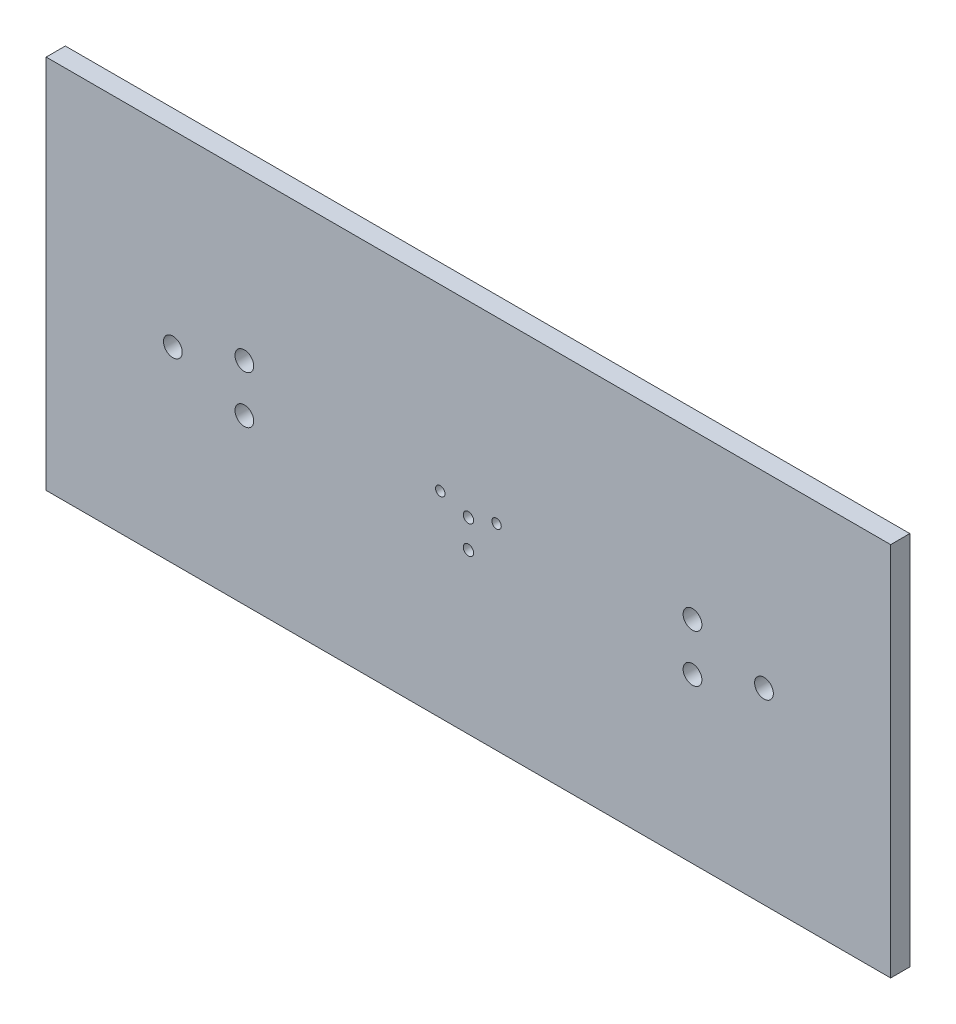
ISO-10303-21;
HEADER;
FILE_DESCRIPTION(('STEP AP214'),'2;1');
FILE_NAME('part.step','',(''),(''),'','','');
FILE_SCHEMA(('AUTOMOTIVE_DESIGN { 1 0 10303 214 1 1 1 1 }'));
ENDSEC;
DATA;
#1=APPLICATION_CONTEXT('core data for automotive mechanical design processes');
#2=APPLICATION_PROTOCOL_DEFINITION('international standard','automotive_design',2000,#1);
#3=PRODUCT_CONTEXT('',#1,'mechanical');
#4=PRODUCT('Part','Part','',(#3));
#5=PRODUCT_RELATED_PRODUCT_CATEGORY('part','',(#4));
#6=PRODUCT_DEFINITION_FORMATION('','',#4);
#7=PRODUCT_DEFINITION_CONTEXT('part definition',#1,'design');
#8=PRODUCT_DEFINITION('design','',#6,#7);
#9=PRODUCT_DEFINITION_SHAPE('','',#8);
#10=(LENGTH_UNIT() NAMED_UNIT(*) SI_UNIT(.MILLI.,.METRE.));
#11=(NAMED_UNIT(*) PLANE_ANGLE_UNIT() SI_UNIT($,.RADIAN.));
#12=(NAMED_UNIT(*) SI_UNIT($,.STERADIAN.) SOLID_ANGLE_UNIT());
#13=UNCERTAINTY_MEASURE_WITH_UNIT(LENGTH_MEASURE(1.E-05),#10,'distance_accuracy_value','');
#14=(GEOMETRIC_REPRESENTATION_CONTEXT(3) GLOBAL_UNCERTAINTY_ASSIGNED_CONTEXT((#13)) GLOBAL_UNIT_ASSIGNED_CONTEXT((#10,
#11,#12)) REPRESENTATION_CONTEXT('',''));
#15=CARTESIAN_POINT('',(0.,0.,0.));
#16=DIRECTION('',(0.,0.,1.));
#17=DIRECTION('',(1.,0.,0.));
#18=AXIS2_PLACEMENT_3D('',#15,#16,#17);
#19=CARTESIAN_POINT('',(0.,0.,0.));
#20=DIRECTION('',(0.,0.,-1.));
#21=DIRECTION('',(-1.,0.,0.));
#22=AXIS2_PLACEMENT_3D('',#19,#20,#21);
#23=PLANE('',#22);
#24=CARTESIAN_POINT('',(68.8799994,22.54000064,0.));
#25=DIRECTION('',(0.,0.,-1.));
#26=DIRECTION('',(-1.,0.,0.));
#27=AXIS2_PLACEMENT_3D('',#24,#25,#26);
#28=CIRCLE('',#27,1.00000054);
#29=CARTESIAN_POINT('',(67.87999886,22.54000064,0.));
#30=VERTEX_POINT('',#29);
#31=EDGE_CURVE('E109',#30,#30,#28,.T.);
#32=ORIENTED_EDGE('',*,*,#31,.T.);
#33=EDGE_LOOP('',(#32));
#34=FACE_BOUND('',#33,.T.);
#35=CARTESIAN_POINT('',(48.0000056,20.9400013,0.));
#36=DIRECTION('',(0.,0.,-1.));
#37=DIRECTION('',(-1.,0.,0.));
#38=AXIS2_PLACEMENT_3D('',#35,#36,#37);
#39=CIRCLE('',#38,0.499999);
#40=CARTESIAN_POINT('',(47.5000066,20.9400013,0.));
#41=VERTEX_POINT('',#40);
#42=EDGE_CURVE('E113',#41,#41,#39,.T.);
#43=ORIENTED_EDGE('',*,*,#42,.T.);
#44=EDGE_LOOP('',(#43));
#45=FACE_BOUND('',#44,.T.);
#46=CARTESIAN_POINT('',(44.9999989,20.00000064,0.));
#47=DIRECTION('',(0.,0.,-1.));
#48=DIRECTION('',(-1.,0.,0.));
#49=AXIS2_PLACEMENT_3D('',#46,#47,#48);
#50=CIRCLE('',#49,0.5499989);
#51=CARTESIAN_POINT('',(44.45,20.00000064,0.));
#52=VERTEX_POINT('',#51);
#53=EDGE_CURVE('E116',#52,#52,#50,.T.);
#54=ORIENTED_EDGE('',*,*,#53,.T.);
#55=EDGE_LOOP('',(#54));
#56=FACE_BOUND('',#55,.T.);
#57=CARTESIAN_POINT('',(76.4999994,20.00000064,0.));
#58=DIRECTION('',(0.,0.,-1.));
#59=DIRECTION('',(-1.,0.,0.));
#60=AXIS2_PLACEMENT_3D('',#57,#58,#59);
#61=CIRCLE('',#60,1.00000054);
#62=CARTESIAN_POINT('',(75.49999886,20.00000064,0.));
#63=VERTEX_POINT('',#62);
#64=EDGE_CURVE('E119',#63,#63,#61,.T.);
#65=ORIENTED_EDGE('',*,*,#64,.T.);
#66=EDGE_LOOP('',(#65));
#67=FACE_BOUND('',#66,.T.);
#68=CARTESIAN_POINT('',(68.8799994,17.46000064,0.));
#69=DIRECTION('',(0.,0.,-1.));
#70=DIRECTION('',(-1.,0.,0.));
#71=AXIS2_PLACEMENT_3D('',#68,#69,#70);
#72=CIRCLE('',#71,1.00000054);
#73=CARTESIAN_POINT('',(67.87999886,17.46000064,0.));
#74=VERTEX_POINT('',#73);
#75=EDGE_CURVE('E122',#74,#74,#72,.T.);
#76=ORIENTED_EDGE('',*,*,#75,.T.);
#77=EDGE_LOOP('',(#76));
#78=FACE_BOUND('',#77,.T.);
#79=CARTESIAN_POINT('',(21.1199984,22.54000064,0.));
#80=DIRECTION('',(0.,0.,-1.));
#81=DIRECTION('',(-1.,0.,0.));
#82=AXIS2_PLACEMENT_3D('',#79,#80,#81);
#83=CIRCLE('',#82,1.00000054);
#84=CARTESIAN_POINT('',(20.11999786,22.54000064,0.));
#85=VERTEX_POINT('',#84);
#86=EDGE_CURVE('E125',#85,#85,#83,.T.);
#87=ORIENTED_EDGE('',*,*,#86,.T.);
#88=EDGE_LOOP('',(#87));
#89=FACE_BOUND('',#88,.T.);
#90=CARTESIAN_POINT('',(41.99999728,20.9400013,0.));
#91=DIRECTION('',(0.,0.,-1.));
#92=DIRECTION('',(-1.,0.,0.));
#93=AXIS2_PLACEMENT_3D('',#90,#91,#92);
#94=CIRCLE('',#93,0.499999);
#95=CARTESIAN_POINT('',(41.49999828,20.9400013,0.));
#96=VERTEX_POINT('',#95);
#97=EDGE_CURVE('E128',#96,#96,#94,.T.);
#98=ORIENTED_EDGE('',*,*,#97,.T.);
#99=EDGE_LOOP('',(#98));
#100=FACE_BOUND('',#99,.T.);
#101=CARTESIAN_POINT('',(13.4999984,20.00000064,0.));
#102=DIRECTION('',(0.,0.,-1.));
#103=DIRECTION('',(-1.,0.,0.));
#104=AXIS2_PLACEMENT_3D('',#101,#102,#103);
#105=CIRCLE('',#104,1.00000054);
#106=CARTESIAN_POINT('',(12.49999786,20.00000064,0.));
#107=VERTEX_POINT('',#106);
#108=EDGE_CURVE('E131',#107,#107,#105,.T.);
#109=ORIENTED_EDGE('',*,*,#108,.T.);
#110=EDGE_LOOP('',(#109));
#111=FACE_BOUND('',#110,.T.);
#112=CARTESIAN_POINT('',(44.9999989,17.00000156,0.));
#113=DIRECTION('',(0.,0.,-1.));
#114=DIRECTION('',(-1.,0.,0.));
#115=AXIS2_PLACEMENT_3D('',#112,#113,#114);
#116=CIRCLE('',#115,0.5499989);
#117=CARTESIAN_POINT('',(44.45,17.00000156,0.));
#118=VERTEX_POINT('',#117);
#119=EDGE_CURVE('E133',#118,#118,#116,.T.);
#120=ORIENTED_EDGE('',*,*,#119,.T.);
#121=EDGE_LOOP('',(#120));
#122=FACE_BOUND('',#121,.T.);
#123=CARTESIAN_POINT('',(21.1199984,17.46000064,0.));
#124=DIRECTION('',(0.,0.,-1.));
#125=DIRECTION('',(-1.,0.,0.));
#126=AXIS2_PLACEMENT_3D('',#123,#124,#125);
#127=CIRCLE('',#126,1.00000054);
#128=CARTESIAN_POINT('',(20.11999786,17.46000064,0.));
#129=VERTEX_POINT('',#128);
#130=EDGE_CURVE('E20',#129,#129,#127,.T.);
#131=ORIENTED_EDGE('',*,*,#130,.T.);
#132=EDGE_LOOP('',(#131));
#133=FACE_BOUND('',#132,.T.);
#134=DIRECTION('',(0.,1.,0.));
#135=VECTOR('',#134,1.);
#136=CARTESIAN_POINT('',(90.,0.,0.));
#137=LINE('',#136,#135);
#138=CARTESIAN_POINT('',(90.,0.,0.));
#139=VERTEX_POINT('',#138);
#140=CARTESIAN_POINT('',(90.,40.,0.));
#141=VERTEX_POINT('',#140);
#142=EDGE_CURVE('E55',#139,#141,#137,.T.);
#143=ORIENTED_EDGE('',*,*,#142,.T.);
#144=DIRECTION('',(1.,0.,0.));
#145=VECTOR('',#144,1.);
#146=CARTESIAN_POINT('',(90.,40.,0.));
#147=LINE('',#146,#145);
#148=CARTESIAN_POINT('',(0.,40.,0.));
#149=VERTEX_POINT('',#148);
#150=EDGE_CURVE('E57',#141,#149,#147,.F.);
#151=ORIENTED_EDGE('',*,*,#150,.T.);
#152=DIRECTION('',(0.,1.,0.));
#153=VECTOR('',#152,1.);
#154=CARTESIAN_POINT('',(0.,40.,0.));
#155=LINE('',#154,#153);
#156=CARTESIAN_POINT('',(0.,0.,0.));
#157=VERTEX_POINT('',#156);
#158=EDGE_CURVE('E59',#149,#157,#155,.F.);
#159=ORIENTED_EDGE('',*,*,#158,.T.);
#160=DIRECTION('',(1.,0.,0.));
#161=VECTOR('',#160,1.);
#162=CARTESIAN_POINT('',(0.,0.,0.));
#163=LINE('',#162,#161);
#164=EDGE_CURVE('E140',#157,#139,#163,.T.);
#165=ORIENTED_EDGE('',*,*,#164,.T.);
#166=EDGE_LOOP('',(#143,#151,#159,#165));
#167=FACE_BOUND('',#166,.T.);
#168=ADVANCED_FACE('F17',(#34,#45,#56,#67,#78,#89,#100,#111,#122,#133,#167),#23,.F.);
#169=CARTESIAN_POINT('',(0.,40.,-2.04144118));
#170=DIRECTION('',(1.,0.,0.));
#171=DIRECTION('',(0.,0.,-1.));
#172=AXIS2_PLACEMENT_3D('',#169,#170,#171);
#173=PLANE('',#172);
#174=DIRECTION('',(0.,0.,1.));
#175=VECTOR('',#174,1.);
#176=CARTESIAN_POINT('',(0.,0.,-2.04144118));
#177=LINE('',#176,#175);
#178=CARTESIAN_POINT('',(0.,0.,-2.04144118));
#179=VERTEX_POINT('',#178);
#180=EDGE_CURVE('E70',#179,#157,#177,.T.);
#181=ORIENTED_EDGE('',*,*,#180,.T.);
#182=ORIENTED_EDGE('',*,*,#158,.F.);
#183=DIRECTION('',(0.,0.,-1.));
#184=VECTOR('',#183,1.);
#185=CARTESIAN_POINT('',(0.,40.,-2.04144118));
#186=LINE('',#185,#184);
#187=CARTESIAN_POINT('',(0.,40.,-2.04144118));
#188=VERTEX_POINT('',#187);
#189=EDGE_CURVE('E64',#149,#188,#186,.T.);
#190=ORIENTED_EDGE('',*,*,#189,.T.);
#191=DIRECTION('',(0.,1.,0.));
#192=VECTOR('',#191,1.);
#193=CARTESIAN_POINT('',(0.,0.,-2.04144118));
#194=LINE('',#193,#192);
#195=EDGE_CURVE('E112',#179,#188,#194,.T.);
#196=ORIENTED_EDGE('',*,*,#195,.F.);
#197=EDGE_LOOP('',(#181,#182,#190,#196));
#198=FACE_BOUND('',#197,.T.);
#199=ADVANCED_FACE('F67',(#198),#173,.F.);
#200=CARTESIAN_POINT('',(90.,40.,-2.04144118));
#201=DIRECTION('',(0.,-1.,0.));
#202=DIRECTION('',(0.,0.,-1.));
#203=AXIS2_PLACEMENT_3D('',#200,#201,#202);
#204=PLANE('',#203);
#205=ORIENTED_EDGE('',*,*,#189,.F.);
#206=ORIENTED_EDGE('',*,*,#150,.F.);
#207=DIRECTION('',(0.,0.,1.));
#208=VECTOR('',#207,1.);
#209=CARTESIAN_POINT('',(90.,40.,-2.04144118));
#210=LINE('',#209,#208);
#211=CARTESIAN_POINT('',(90.,40.,-2.04144118));
#212=VERTEX_POINT('',#211);
#213=EDGE_CURVE('E78',#141,#212,#210,.F.);
#214=ORIENTED_EDGE('',*,*,#213,.T.);
#215=DIRECTION('',(-1.,0.,0.));
#216=VECTOR('',#215,1.);
#217=CARTESIAN_POINT('',(0.,40.,-2.04144118));
#218=LINE('',#217,#216);
#219=EDGE_CURVE('E75',#188,#212,#218,.F.);
#220=ORIENTED_EDGE('',*,*,#219,.F.);
#221=EDGE_LOOP('',(#205,#206,#214,#220));
#222=FACE_BOUND('',#221,.T.);
#223=ADVANCED_FACE('F73',(#222),#204,.F.);
#224=CARTESIAN_POINT('',(90.,0.,-2.04144118));
#225=DIRECTION('',(-1.,0.,0.));
#226=DIRECTION('',(0.,0.,1.));
#227=AXIS2_PLACEMENT_3D('',#224,#225,#226);
#228=PLANE('',#227);
#229=ORIENTED_EDGE('',*,*,#213,.F.);
#230=ORIENTED_EDGE('',*,*,#142,.F.);
#231=DIRECTION('',(0.,0.,1.));
#232=VECTOR('',#231,1.);
#233=CARTESIAN_POINT('',(90.,0.,-2.04144118));
#234=LINE('',#233,#232);
#235=CARTESIAN_POINT('',(90.,0.,-2.04144118));
#236=VERTEX_POINT('',#235);
#237=EDGE_CURVE('E35',#139,#236,#234,.F.);
#238=ORIENTED_EDGE('',*,*,#237,.T.);
#239=DIRECTION('',(0.,1.,0.));
#240=VECTOR('',#239,1.);
#241=CARTESIAN_POINT('',(90.,0.,-2.04144118));
#242=LINE('',#241,#240);
#243=EDGE_CURVE('E147',#212,#236,#242,.F.);
#244=ORIENTED_EDGE('',*,*,#243,.F.);
#245=EDGE_LOOP('',(#229,#230,#238,#244));
#246=FACE_BOUND('',#245,.T.);
#247=ADVANCED_FACE('F148',(#246),#228,.F.);
#248=CARTESIAN_POINT('',(0.,0.,-2.04144118));
#249=DIRECTION('',(0.,1.,0.));
#250=DIRECTION('',(0.,0.,1.));
#251=AXIS2_PLACEMENT_3D('',#248,#249,#250);
#252=PLANE('',#251);
#253=ORIENTED_EDGE('',*,*,#237,.F.);
#254=ORIENTED_EDGE('',*,*,#164,.F.);
#255=ORIENTED_EDGE('',*,*,#180,.F.);
#256=DIRECTION('',(-1.,0.,0.));
#257=VECTOR('',#256,1.);
#258=CARTESIAN_POINT('',(0.,0.,-2.04144118));
#259=LINE('',#258,#257);
#260=EDGE_CURVE('E108',#236,#179,#259,.T.);
#261=ORIENTED_EDGE('',*,*,#260,.F.);
#262=EDGE_LOOP('',(#253,#254,#255,#261));
#263=FACE_BOUND('',#262,.T.);
#264=ADVANCED_FACE('F155',(#263),#252,.F.);
#265=CARTESIAN_POINT('',(21.1199984,17.46000064,-2.04144118));
#266=DIRECTION('',(0.,0.,-1.));
#267=DIRECTION('',(-1.,0.,0.));
#268=AXIS2_PLACEMENT_3D('',#265,#266,#267);
#269=CYLINDRICAL_SURFACE('',#268,1.00000054);
#270=ORIENTED_EDGE('',*,*,#130,.F.);
#271=EDGE_LOOP('',(#270));
#272=FACE_BOUND('',#271,.T.);
#273=CARTESIAN_POINT('',(21.1199984,17.46000064,-2.04144118));
#274=DIRECTION('',(0.,0.,-1.));
#275=DIRECTION('',(-1.,0.,0.));
#276=AXIS2_PLACEMENT_3D('',#273,#274,#275);
#277=CIRCLE('',#276,1.00000054);
#278=CARTESIAN_POINT('',(20.11999786,17.46000064,-2.04144118));
#279=VERTEX_POINT('',#278);
#280=EDGE_CURVE('E105',#279,#279,#277,.F.);
#281=ORIENTED_EDGE('',*,*,#280,.F.);
#282=EDGE_LOOP('',(#281));
#283=FACE_BOUND('',#282,.T.);
#284=ADVANCED_FACE('F157',(#272,#283),#269,.F.);
#285=CARTESIAN_POINT('',(44.9999989,17.00000156,-2.04144118));
#286=DIRECTION('',(0.,0.,-1.));
#287=DIRECTION('',(-1.,0.,0.));
#288=AXIS2_PLACEMENT_3D('',#285,#286,#287);
#289=CYLINDRICAL_SURFACE('',#288,0.5499989);
#290=ORIENTED_EDGE('',*,*,#119,.F.);
#291=EDGE_LOOP('',(#290));
#292=FACE_BOUND('',#291,.T.);
#293=CARTESIAN_POINT('',(44.9999989,17.00000156,-2.04144118));
#294=DIRECTION('',(0.,0.,-1.));
#295=DIRECTION('',(-1.,0.,0.));
#296=AXIS2_PLACEMENT_3D('',#293,#294,#295);
#297=CIRCLE('',#296,0.5499989);
#298=CARTESIAN_POINT('',(44.45,17.00000156,-2.04144118));
#299=VERTEX_POINT('',#298);
#300=EDGE_CURVE('E102',#299,#299,#297,.F.);
#301=ORIENTED_EDGE('',*,*,#300,.F.);
#302=EDGE_LOOP('',(#301));
#303=FACE_BOUND('',#302,.T.);
#304=ADVANCED_FACE('F164',(#292,#303),#289,.F.);
#305=CARTESIAN_POINT('',(13.4999984,20.00000064,-2.04144118));
#306=DIRECTION('',(0.,0.,-1.));
#307=DIRECTION('',(-1.,0.,0.));
#308=AXIS2_PLACEMENT_3D('',#305,#306,#307);
#309=CYLINDRICAL_SURFACE('',#308,1.00000054);
#310=ORIENTED_EDGE('',*,*,#108,.F.);
#311=EDGE_LOOP('',(#310));
#312=FACE_BOUND('',#311,.T.);
#313=CARTESIAN_POINT('',(13.4999984,20.00000064,-2.04144118));
#314=DIRECTION('',(0.,0.,-1.));
#315=DIRECTION('',(-1.,0.,0.));
#316=AXIS2_PLACEMENT_3D('',#313,#314,#315);
#317=CIRCLE('',#316,1.00000054);
#318=CARTESIAN_POINT('',(12.49999786,20.00000064,-2.04144118));
#319=VERTEX_POINT('',#318);
#320=EDGE_CURVE('E99',#319,#319,#317,.F.);
#321=ORIENTED_EDGE('',*,*,#320,.F.);
#322=EDGE_LOOP('',(#321));
#323=FACE_BOUND('',#322,.T.);
#324=ADVANCED_FACE('F202',(#312,#323),#309,.F.);
#325=CARTESIAN_POINT('',(41.99999728,20.9400013,-2.04144118));
#326=DIRECTION('',(0.,0.,-1.));
#327=DIRECTION('',(-1.,0.,0.));
#328=AXIS2_PLACEMENT_3D('',#325,#326,#327);
#329=CYLINDRICAL_SURFACE('',#328,0.499999);
#330=ORIENTED_EDGE('',*,*,#97,.F.);
#331=EDGE_LOOP('',(#330));
#332=FACE_BOUND('',#331,.T.);
#333=CARTESIAN_POINT('',(41.99999728,20.9400013,-2.04144118));
#334=DIRECTION('',(0.,0.,-1.));
#335=DIRECTION('',(-1.,0.,0.));
#336=AXIS2_PLACEMENT_3D('',#333,#334,#335);
#337=CIRCLE('',#336,0.499999);
#338=CARTESIAN_POINT('',(41.49999828,20.9400013,-2.04144118));
#339=VERTEX_POINT('',#338);
#340=EDGE_CURVE('E96',#339,#339,#337,.F.);
#341=ORIENTED_EDGE('',*,*,#340,.F.);
#342=EDGE_LOOP('',(#341));
#343=FACE_BOUND('',#342,.T.);
#344=ADVANCED_FACE('F198',(#332,#343),#329,.F.);
#345=CARTESIAN_POINT('',(21.1199984,22.54000064,-2.04144118));
#346=DIRECTION('',(0.,0.,-1.));
#347=DIRECTION('',(-1.,0.,0.));
#348=AXIS2_PLACEMENT_3D('',#345,#346,#347);
#349=CYLINDRICAL_SURFACE('',#348,1.00000054);
#350=ORIENTED_EDGE('',*,*,#86,.F.);
#351=EDGE_LOOP('',(#350));
#352=FACE_BOUND('',#351,.T.);
#353=CARTESIAN_POINT('',(21.1199984,22.54000064,-2.04144118));
#354=DIRECTION('',(0.,0.,-1.));
#355=DIRECTION('',(-1.,0.,0.));
#356=AXIS2_PLACEMENT_3D('',#353,#354,#355);
#357=CIRCLE('',#356,1.00000054);
#358=CARTESIAN_POINT('',(20.11999786,22.54000064,-2.04144118));
#359=VERTEX_POINT('',#358);
#360=EDGE_CURVE('E93',#359,#359,#357,.F.);
#361=ORIENTED_EDGE('',*,*,#360,.F.);
#362=EDGE_LOOP('',(#361));
#363=FACE_BOUND('',#362,.T.);
#364=ADVANCED_FACE('F194',(#352,#363),#349,.F.);
#365=CARTESIAN_POINT('',(68.8799994,17.46000064,-2.04144118));
#366=DIRECTION('',(0.,0.,-1.));
#367=DIRECTION('',(-1.,0.,0.));
#368=AXIS2_PLACEMENT_3D('',#365,#366,#367);
#369=CYLINDRICAL_SURFACE('',#368,1.00000054);
#370=ORIENTED_EDGE('',*,*,#75,.F.);
#371=EDGE_LOOP('',(#370));
#372=FACE_BOUND('',#371,.T.);
#373=CARTESIAN_POINT('',(68.8799994,17.46000064,-2.04144118));
#374=DIRECTION('',(0.,0.,-1.));
#375=DIRECTION('',(-1.,0.,0.));
#376=AXIS2_PLACEMENT_3D('',#373,#374,#375);
#377=CIRCLE('',#376,1.00000054);
#378=CARTESIAN_POINT('',(67.87999886,17.46000064,-2.04144118));
#379=VERTEX_POINT('',#378);
#380=EDGE_CURVE('E90',#379,#379,#377,.F.);
#381=ORIENTED_EDGE('',*,*,#380,.F.);
#382=EDGE_LOOP('',(#381));
#383=FACE_BOUND('',#382,.T.);
#384=ADVANCED_FACE('F190',(#372,#383),#369,.F.);
#385=CARTESIAN_POINT('',(76.4999994,20.00000064,-2.04144118));
#386=DIRECTION('',(0.,0.,-1.));
#387=DIRECTION('',(-1.,0.,0.));
#388=AXIS2_PLACEMENT_3D('',#385,#386,#387);
#389=CYLINDRICAL_SURFACE('',#388,1.00000054);
#390=ORIENTED_EDGE('',*,*,#64,.F.);
#391=EDGE_LOOP('',(#390));
#392=FACE_BOUND('',#391,.T.);
#393=CARTESIAN_POINT('',(76.4999994,20.00000064,-2.04144118));
#394=DIRECTION('',(0.,0.,-1.));
#395=DIRECTION('',(-1.,0.,0.));
#396=AXIS2_PLACEMENT_3D('',#393,#394,#395);
#397=CIRCLE('',#396,1.00000054);
#398=CARTESIAN_POINT('',(75.49999886,20.00000064,-2.04144118));
#399=VERTEX_POINT('',#398);
#400=EDGE_CURVE('E87',#399,#399,#397,.F.);
#401=ORIENTED_EDGE('',*,*,#400,.F.);
#402=EDGE_LOOP('',(#401));
#403=FACE_BOUND('',#402,.T.);
#404=ADVANCED_FACE('F186',(#392,#403),#389,.F.);
#405=CARTESIAN_POINT('',(44.9999989,20.00000064,-2.04144118));
#406=DIRECTION('',(0.,0.,-1.));
#407=DIRECTION('',(-1.,0.,0.));
#408=AXIS2_PLACEMENT_3D('',#405,#406,#407);
#409=CYLINDRICAL_SURFACE('',#408,0.5499989);
#410=ORIENTED_EDGE('',*,*,#53,.F.);
#411=EDGE_LOOP('',(#410));
#412=FACE_BOUND('',#411,.T.);
#413=CARTESIAN_POINT('',(44.9999989,20.00000064,-2.04144118));
#414=DIRECTION('',(0.,0.,-1.));
#415=DIRECTION('',(-1.,0.,0.));
#416=AXIS2_PLACEMENT_3D('',#413,#414,#415);
#417=CIRCLE('',#416,0.5499989);
#418=CARTESIAN_POINT('',(44.45,20.00000064,-2.04144118));
#419=VERTEX_POINT('',#418);
#420=EDGE_CURVE('E84',#419,#419,#417,.F.);
#421=ORIENTED_EDGE('',*,*,#420,.F.);
#422=EDGE_LOOP('',(#421));
#423=FACE_BOUND('',#422,.T.);
#424=ADVANCED_FACE('F182',(#412,#423),#409,.F.);
#425=CARTESIAN_POINT('',(48.0000056,20.9400013,-2.04144118));
#426=DIRECTION('',(0.,0.,-1.));
#427=DIRECTION('',(-1.,0.,0.));
#428=AXIS2_PLACEMENT_3D('',#425,#426,#427);
#429=CYLINDRICAL_SURFACE('',#428,0.499999);
#430=ORIENTED_EDGE('',*,*,#42,.F.);
#431=EDGE_LOOP('',(#430));
#432=FACE_BOUND('',#431,.T.);
#433=CARTESIAN_POINT('',(48.0000056,20.9400013,-2.04144118));
#434=DIRECTION('',(0.,0.,-1.));
#435=DIRECTION('',(-1.,0.,0.));
#436=AXIS2_PLACEMENT_3D('',#433,#434,#435);
#437=CIRCLE('',#436,0.499999);
#438=CARTESIAN_POINT('',(47.5000066,20.9400013,-2.04144118));
#439=VERTEX_POINT('',#438);
#440=EDGE_CURVE('E26',#439,#439,#437,.F.);
#441=ORIENTED_EDGE('',*,*,#440,.F.);
#442=EDGE_LOOP('',(#441));
#443=FACE_BOUND('',#442,.T.);
#444=ADVANCED_FACE('F175',(#432,#443),#429,.F.);
#445=CARTESIAN_POINT('',(68.8799994,22.54000064,-2.04144118));
#446=DIRECTION('',(0.,0.,-1.));
#447=DIRECTION('',(-1.,0.,0.));
#448=AXIS2_PLACEMENT_3D('',#445,#446,#447);
#449=CYLINDRICAL_SURFACE('',#448,1.00000054);
#450=ORIENTED_EDGE('',*,*,#31,.F.);
#451=EDGE_LOOP('',(#450));
#452=FACE_BOUND('',#451,.T.);
#453=CARTESIAN_POINT('',(68.8799994,22.54000064,-2.04144118));
#454=DIRECTION('',(0.,0.,-1.));
#455=DIRECTION('',(-1.,0.,0.));
#456=AXIS2_PLACEMENT_3D('',#453,#454,#455);
#457=CIRCLE('',#456,1.00000054);
#458=CARTESIAN_POINT('',(67.87999886,22.54000064,-2.04144118));
#459=VERTEX_POINT('',#458);
#460=EDGE_CURVE('E11',#459,#459,#457,.F.);
#461=ORIENTED_EDGE('',*,*,#460,.F.);
#462=EDGE_LOOP('',(#461));
#463=FACE_BOUND('',#462,.T.);
#464=ADVANCED_FACE('F169',(#452,#463),#449,.F.);
#465=CARTESIAN_POINT('',(0.,0.,-2.04144118));
#466=DIRECTION('',(0.,0.,-1.));
#467=DIRECTION('',(-1.,0.,0.));
#468=AXIS2_PLACEMENT_3D('',#465,#466,#467);
#469=PLANE('',#468);
#470=ORIENTED_EDGE('',*,*,#460,.T.);
#471=EDGE_LOOP('',(#470));
#472=FACE_BOUND('',#471,.T.);
#473=ORIENTED_EDGE('',*,*,#440,.T.);
#474=EDGE_LOOP('',(#473));
#475=FACE_BOUND('',#474,.T.);
#476=ORIENTED_EDGE('',*,*,#420,.T.);
#477=EDGE_LOOP('',(#476));
#478=FACE_BOUND('',#477,.T.);
#479=ORIENTED_EDGE('',*,*,#400,.T.);
#480=EDGE_LOOP('',(#479));
#481=FACE_BOUND('',#480,.T.);
#482=ORIENTED_EDGE('',*,*,#380,.T.);
#483=EDGE_LOOP('',(#482));
#484=FACE_BOUND('',#483,.T.);
#485=ORIENTED_EDGE('',*,*,#360,.T.);
#486=EDGE_LOOP('',(#485));
#487=FACE_BOUND('',#486,.T.);
#488=ORIENTED_EDGE('',*,*,#340,.T.);
#489=EDGE_LOOP('',(#488));
#490=FACE_BOUND('',#489,.T.);
#491=ORIENTED_EDGE('',*,*,#320,.T.);
#492=EDGE_LOOP('',(#491));
#493=FACE_BOUND('',#492,.T.);
#494=ORIENTED_EDGE('',*,*,#300,.T.);
#495=EDGE_LOOP('',(#494));
#496=FACE_BOUND('',#495,.T.);
#497=ORIENTED_EDGE('',*,*,#280,.T.);
#498=EDGE_LOOP('',(#497));
#499=FACE_BOUND('',#498,.T.);
#500=ORIENTED_EDGE('',*,*,#243,.T.);
#501=ORIENTED_EDGE('',*,*,#260,.T.);
#502=ORIENTED_EDGE('',*,*,#195,.T.);
#503=ORIENTED_EDGE('',*,*,#219,.T.);
#504=EDGE_LOOP('',(#500,#501,#502,#503));
#505=FACE_BOUND('',#504,.T.);
#506=ADVANCED_FACE('F152',(#472,#475,#478,#481,#484,#487,#490,#493,#496,#499,#505),#469,.T.);
#507=CLOSED_SHELL('',(#168,#199,#223,#247,#264,#284,#304,#324,#344,#364,#384,#404,#424,#444,
#464,#506));
#508=MANIFOLD_SOLID_BREP('B1',#507);
#509=ADVANCED_BREP_SHAPE_REPRESENTATION('',(#18,#508),#14);
#510=SHAPE_DEFINITION_REPRESENTATION(#9,#509);
ENDSEC;
END-ISO-10303-21;
